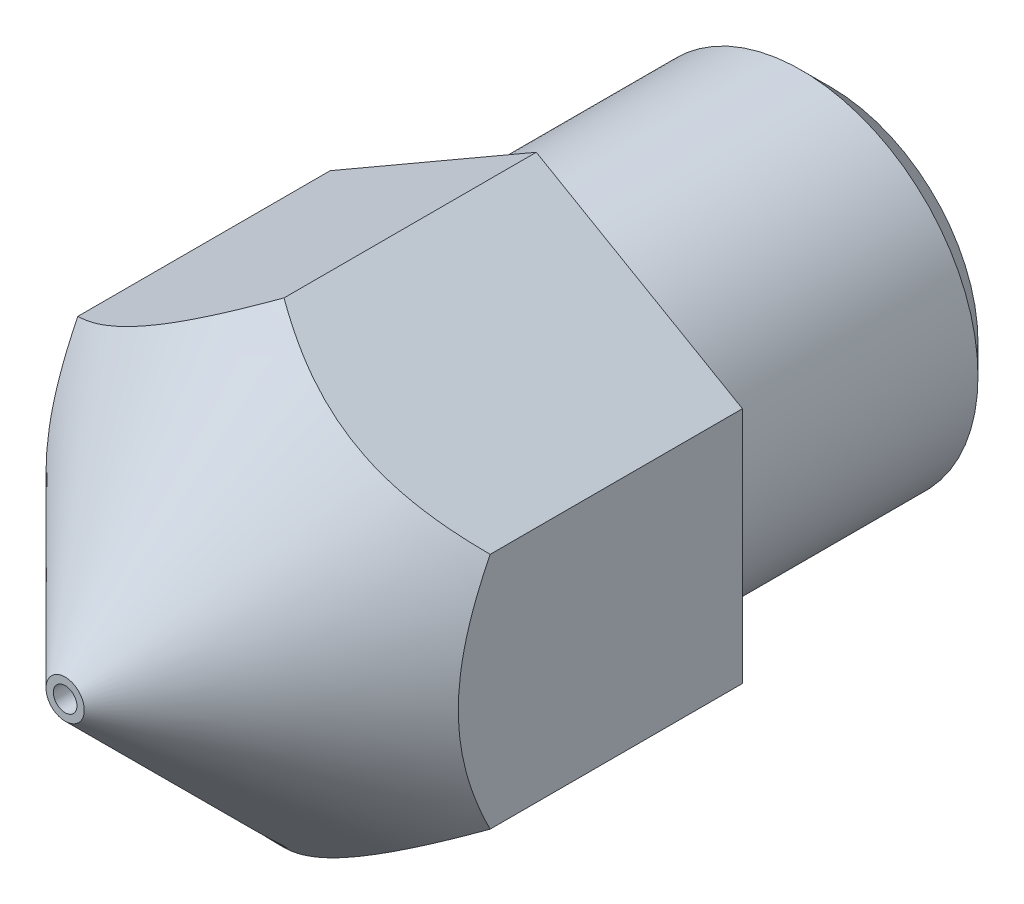
ISO-10303-21;
HEADER;
FILE_DESCRIPTION(('STEP AP214'),'2;1');
FILE_NAME('part.step','',(''),(''),'','','');
FILE_SCHEMA(('AUTOMOTIVE_DESIGN { 1 0 10303 214 1 1 1 1 }'));
ENDSEC;
DATA;
#1=APPLICATION_CONTEXT('core data for automotive mechanical design processes');
#2=APPLICATION_PROTOCOL_DEFINITION('international standard','automotive_design',2000,#1);
#3=PRODUCT_CONTEXT('',#1,'mechanical');
#4=PRODUCT('Part','Part','',(#3));
#5=PRODUCT_RELATED_PRODUCT_CATEGORY('part','',(#4));
#6=PRODUCT_DEFINITION_FORMATION('','',#4);
#7=PRODUCT_DEFINITION_CONTEXT('part definition',#1,'design');
#8=PRODUCT_DEFINITION('design','',#6,#7);
#9=PRODUCT_DEFINITION_SHAPE('','',#8);
#10=(LENGTH_UNIT() NAMED_UNIT(*) SI_UNIT(.MILLI.,.METRE.));
#11=(NAMED_UNIT(*) PLANE_ANGLE_UNIT() SI_UNIT($,.RADIAN.));
#12=(NAMED_UNIT(*) SI_UNIT($,.STERADIAN.) SOLID_ANGLE_UNIT());
#13=UNCERTAINTY_MEASURE_WITH_UNIT(LENGTH_MEASURE(1.E-05),#10,'distance_accuracy_value','');
#14=(GEOMETRIC_REPRESENTATION_CONTEXT(3) GLOBAL_UNCERTAINTY_ASSIGNED_CONTEXT((#13)) GLOBAL_UNIT_ASSIGNED_CONTEXT((#10,
#11,#12)) REPRESENTATION_CONTEXT('',''));
#15=CARTESIAN_POINT('',(0.,0.,0.));
#16=DIRECTION('',(0.,0.,1.));
#17=DIRECTION('',(1.,0.,0.));
#18=AXIS2_PLACEMENT_3D('',#15,#16,#17);
#19=CARTESIAN_POINT('',(0.,0.,13.));
#20=DIRECTION('',(0.,0.,-1.));
#21=DIRECTION('',(-1.,0.,0.));
#22=AXIS2_PLACEMENT_3D('',#19,#20,#21);
#23=CONICAL_SURFACE('',#22,0.325000000000002,0.785398163397447);
#24=CARTESIAN_POINT('',(0.,0.,13.));
#25=DIRECTION('',(0.,0.,-1.));
#26=DIRECTION('',(-1.,0.,0.));
#27=AXIS2_PLACEMENT_3D('',#24,#25,#26);
#28=CIRCLE('',#27,0.325000000000002);
#29=CARTESIAN_POINT('',(-0.325000000000002,0.,13.));
#30=VERTEX_POINT('',#29);
#31=EDGE_CURVE('E182',#30,#30,#28,.T.);
#32=ORIENTED_EDGE('',*,*,#31,.T.);
#33=EDGE_LOOP('',(#32));
#34=FACE_BOUND('',#33,.T.);
#35=CARTESIAN_POINT('',(3.5,-15.5234481897634,-2.58812174591366));
#36=CARTESIAN_POINT('',(3.5,-15.1636242601623,-2.23712539732561));
#37=CARTESIAN_POINT('',(3.5,-14.8035205175906,-1.88641516489563));
#38=CARTESIAN_POINT('',(3.5,-14.0819201954618,-1.18510371729995));
#39=CARTESIAN_POINT('',(3.5,-13.7204222725227,-0.834503884606979));
#40=CARTESIAN_POINT('',(3.5,-12.9851632461589,-0.123253918607061));
#41=CARTESIAN_POINT('',(3.5,-12.6113732691067,0.237366383018881));
#42=CARTESIAN_POINT('',(3.5,-11.8632476898643,0.956650604807089));
#43=CARTESIAN_POINT('',(3.5,-11.4889143844432,1.3153169126455));
#44=CARTESIAN_POINT('',(3.5,-10.7337152504074,2.03564308802298));
#45=CARTESIAN_POINT('',(3.5,-10.3528280885022,2.39728061377324));
#46=CARTESIAN_POINT('',(3.5,-9.58872388033201,3.11825712856995));
#47=CARTESIAN_POINT('',(3.5,-9.20550633866682,3.47759559300201));
#48=CARTESIAN_POINT('',(3.5,-8.43292594909807,4.19572688391259));
#49=CARTESIAN_POINT('',(3.5,-8.04353847587837,4.55449330824109));
#50=CARTESIAN_POINT('',(3.5,-7.45613433125934,5.08865399411039));
#51=CARTESIAN_POINT('',(3.5,-7.25986380764518,5.2659677223504));
#52=CARTESIAN_POINT('',(3.5,-6.86588186461854,5.61898578873293));
#53=CARTESIAN_POINT('',(3.5,-6.66817045798153,5.79469014111373));
#54=CARTESIAN_POINT('',(3.5,-6.27710677250364,6.13864603820222));
#55=CARTESIAN_POINT('',(3.5,-6.08380929608817,6.30695979649324));
#56=CARTESIAN_POINT('',(3.5,-5.69508116254242,6.64113302112362));
#57=CARTESIAN_POINT('',(3.5,-5.49965038532669,6.80699234804992));
#58=CARTESIAN_POINT('',(3.5,-5.10539453520259,7.13604194454556));
#59=CARTESIAN_POINT('',(3.5,-4.90656004527705,7.29922097042713));
#60=CARTESIAN_POINT('',(3.5,-4.50537353784658,7.62113735661519));
#61=CARTESIAN_POINT('',(3.5,-4.30302214236045,7.77987548965845));
#62=CARTESIAN_POINT('',(3.5,-3.89676183067198,8.08882331868253));
#63=CARTESIAN_POINT('',(3.5,-3.69292489418594,8.23912670823939));
#64=CARTESIAN_POINT('',(3.5,-3.38250138019312,8.45817533010815));
#65=CARTESIAN_POINT('',(3.5,-3.27819886554989,8.53015603273438));
#66=CARTESIAN_POINT('',(3.5,-3.06781525297658,8.67146340791987));
#67=CARTESIAN_POINT('',(3.5,-2.96173428541553,8.74079027380531));
#68=CARTESIAN_POINT('',(3.5,-2.74814793574133,8.87578541870253));
#69=CARTESIAN_POINT('',(3.5,-2.64065485663612,8.94147308798704));
#70=CARTESIAN_POINT('',(3.5,-2.42330140274558,9.06887107421913));
#71=CARTESIAN_POINT('',(3.5,-2.31344068232646,9.13058080513782));
#72=CARTESIAN_POINT('',(3.5,-2.09124355588498,9.24891478346324));
#73=CARTESIAN_POINT('',(3.5,-1.97891174750918,9.30554762001907));
#74=CARTESIAN_POINT('',(3.5,-1.75133226285868,9.41257237776955));
#75=CARTESIAN_POINT('',(3.5,-1.63608601506468,9.46296728765808));
#76=CARTESIAN_POINT('',(3.5,-1.49025089005427,9.52103644619228));
#77=CARTESIAN_POINT('',(3.5,-1.46110056481546,9.53236470492607));
#78=CARTESIAN_POINT('',(3.5,-1.402601107607,9.55451508791755));
#79=CARTESIAN_POINT('',(3.5,-1.37325193594393,9.56533710749575));
#80=CARTESIAN_POINT('',(3.5,-1.28488951412708,9.59700909912121));
#81=CARTESIAN_POINT('',(3.5,-1.22558525994879,9.61705544160064));
#82=CARTESIAN_POINT('',(3.5,-1.10624184328518,9.65477285811323));
#83=CARTESIAN_POINT('',(3.5,-1.04620287938741,9.67244455917323));
#84=CARTESIAN_POINT('',(3.5,-0.92542254777725,9.70518946936908));
#85=CARTESIAN_POINT('',(3.5,-0.864681236092734,9.72026288427077));
#86=CARTESIAN_POINT('',(3.5,-0.744176235583252,9.74722921369906));
#87=CARTESIAN_POINT('',(3.5,-0.684429101789748,9.75919561995199));
#88=CARTESIAN_POINT('',(3.5,-0.564438250966739,9.78027207473867));
#89=CARTESIAN_POINT('',(3.5,-0.504194540567017,9.7893821613439));
#90=CARTESIAN_POINT('',(3.5,-0.322837843942376,9.81218328184672));
#91=CARTESIAN_POINT('',(3.5,-0.201113027289824,9.82134203443566));
#92=CARTESIAN_POINT('',(3.5,0.0380130971471712,9.82675953589181));
#93=CARTESIAN_POINT('',(3.5,0.155404466788706,9.82349141691179));
#94=CARTESIAN_POINT('',(3.5,0.389244043366204,9.80535184085907));
#95=CARTESIAN_POINT('',(3.5,0.505692490432156,9.79048343829789));
#96=CARTESIAN_POINT('',(3.5,0.737684831131093,9.74994653628783));
#97=CARTESIAN_POINT('',(3.5,0.853212486127755,9.72418681194919));
#98=CARTESIAN_POINT('',(3.5,1.08176746257524,9.66329658620028));
#99=CARTESIAN_POINT('',(3.5,1.19479404392223,9.62816335015079));
#100=CARTESIAN_POINT('',(3.5,1.42047293020801,9.54924566948267));
#101=CARTESIAN_POINT('',(3.5,1.53306533107008,9.50529199646975));
#102=CARTESIAN_POINT('',(3.5,1.75543329006004,9.41074245035333));
#103=CARTESIAN_POINT('',(3.5,1.8652080370074,9.36014468954995));
#104=CARTESIAN_POINT('',(3.5,2.08227629391203,9.25352327896908));
#105=CARTESIAN_POINT('',(3.5,2.18956577780165,9.19749149693629));
#106=CARTESIAN_POINT('',(3.5,2.40174552846124,9.08112035594987));
#107=CARTESIAN_POINT('',(3.5,2.5066361730213,9.02078168153802));
#108=CARTESIAN_POINT('',(3.5,2.71579156320912,8.8957338997214));
#109=CARTESIAN_POINT('',(3.5,2.82002639429815,8.83097498995069));
#110=CARTESIAN_POINT('',(3.5,3.02662080629836,8.6985379897759));
#111=CARTESIAN_POINT('',(3.5,3.12898034259079,8.63085983004252));
#112=CARTESIAN_POINT('',(3.5,3.33197761839238,8.49317681854608));
#113=CARTESIAN_POINT('',(3.5,3.4326168831748,8.42317420922879));
#114=CARTESIAN_POINT('',(3.5,3.63248156564202,8.28119277503341));
#115=CARTESIAN_POINT('',(3.5,3.73170703846633,8.20921402754922));
#116=CARTESIAN_POINT('',(3.5,4.06086329165638,7.96624133315297));
#117=CARTESIAN_POINT('',(3.5,4.28809301128115,7.79158774422029));
#118=CARTESIAN_POINT('',(3.5,4.73778042292989,7.43622370645637));
#119=CARTESIAN_POINT('',(3.5,4.96023728057273,7.25551221251901));
#120=CARTESIAN_POINT('',(3.5,5.40169374802767,6.88970411681872));
#121=CARTESIAN_POINT('',(3.5,5.6206915797464,6.7046053747019));
#122=CARTESIAN_POINT('',(3.5,6.05598531098002,6.33125553360428));
#123=CARTESIAN_POINT('',(3.5,6.27228113350623,6.14300434515649));
#124=CARTESIAN_POINT('',(3.5,6.70327139644728,5.76369333069582));
#125=CARTESIAN_POINT('',(3.5,6.91796104039656,5.57262806384923));
#126=CARTESIAN_POINT('',(3.5,7.34568317702818,5.18864806158685));
#127=CARTESIAN_POINT('',(3.5,7.55871564473748,4.99573329839726));
#128=CARTESIAN_POINT('',(3.5,8.19570678017715,4.41495098768638));
#129=CARTESIAN_POINT('',(3.5,8.61769582122788,4.02492418910578));
#130=CARTESIAN_POINT('',(3.5,9.4059343366299,3.28985339178753));
#131=CARTESIAN_POINT('',(3.5,9.77259156299894,2.94524491706271));
#132=CARTESIAN_POINT('',(3.5,10.5039660521083,2.25390920904621));
#133=CARTESIAN_POINT('',(3.5,10.868683134223,1.90718178472289));
#134=CARTESIAN_POINT('',(3.5,11.5951246442549,1.21363081090819));
#135=CARTESIAN_POINT('',(3.5,11.9568552096618,0.866813682093247));
#136=CARTESIAN_POINT('',(3.5,12.6791294576359,0.17202194664951));
#137=CARTESIAN_POINT('',(3.5,13.0396732620959,-0.175952533226272));
#138=CARTESIAN_POINT('',(3.5,13.3998004503878,-0.524355656860472));
#139=B_SPLINE_CURVE_WITH_KNOTS('',3,(#35,#36,#37,#38,#39,#40,#41,#42,#43,#44,#45,#46,#47,#48,
#49,#50,#51,#52,#53,#54,#55,#56,#57,#58,#59,#60,#61,#62,#63,#64,#65,#66,#67,#68,#69,#70,#71,#72,
#73,#74,#75,#76,#77,#78,#79,#80,#81,#82,#83,#84,#85,#86,#87,#88,#89,#90,#91,#92,#93,#94,#95,#96,
#97,#98,#99,#100,#101,#102,#103,#104,#105,#106,#107,#108,#109,#110,#111,#112,#113,#114,#115,
#116,#117,#118,#119,#120,#121,#122,#123,#124,#125,#126,#127,#128,#129,#130,#131,#132,#133,#134,
#135,#136,#137,#138),.UNSPECIFIED.,.F.,.F.,(4,2,2,2,2,2,2,2,2,2,2,2,2,2,2,2,2,2,2,2,2,2,2,2,2,2,
2,2,2,2,2,2,2,2,2,2,2,2,2,2,2,2,2,2,2,2,2,2,2,2,2,4),(0.,1.5079943903288,3.01875757635978,
4.5769250878872,6.13220347788174,7.7078576409595,9.28385936663637,10.8722264785119,
11.6657313510458,12.4592291965835,13.2281351674854,13.9970846463216,14.7686993525777,
15.5401789483606,16.2997773384333,16.6799331242335,17.0600611636139,17.4379172356492,
17.8158288467267,18.1930885358389,18.5701667681494,18.6639857705343,18.7578240877067,
18.9455779113769,19.1332820605991,19.3209713381475,19.5037030933086,19.6864324127608,
20.0519331395699,20.4036598996594,20.7552940765806,21.1099337580521,21.4646770158676,
21.8270208208417,22.1894677975897,22.5524658178429,22.9154062707506,23.2834880438917,
23.6515785634306,24.0193237446915,24.3870545439897,25.246664428781,26.1064233839793,
26.9666107827922,27.826822635382,28.6890027213321,29.5511957749455,31.2750339328956,
32.7845731128908,34.2942504527183,35.7976371762235,37.3008643410337),.UNSPECIFIED.);
#140=CARTESIAN_POINT('',(3.5,2.02072594216368,9.28354811567261));
#141=VERTEX_POINT('',#140);
#142=CARTESIAN_POINT('',(3.5,-2.0207259421637,9.2835481156726));
#143=VERTEX_POINT('',#142);
#144=EDGE_CURVE('E158',#141,#143,#139,.F.);
#145=ORIENTED_EDGE('',*,*,#144,.F.);
#146=CARTESIAN_POINT('',(-0.000199999999999833,4.04156735438121,9.2834326406702));
#147=CARTESIAN_POINT('',(0.120108757817009,3.97210706066969,9.35283218194129));
#148=CARTESIAN_POINT('',(0.242429214365458,3.90148531215405,9.41815563681709));
#149=CARTESIAN_POINT('',(0.491853884911904,3.75747991147152,9.53776106398608));
#150=CARTESIAN_POINT('',(0.61898181684255,3.68408256574984,9.59197649279322));
#151=CARTESIAN_POINT('',(0.875329162282521,3.53608035685403,9.68484844043878));
#152=CARTESIAN_POINT('',(1.00448329914368,3.46151318117029,9.72373837546509));
#153=CARTESIAN_POINT('',(1.26563479388694,3.31073729538099,9.78365621127953));
#154=CARTESIAN_POINT('',(1.39762417499827,3.23453319066619,9.80472883532499));
#155=CARTESIAN_POINT('',(1.62510370665134,3.10319782183117,9.82374200102426));
#156=CARTESIAN_POINT('',(1.72030010780514,3.04823615399913,9.82655641581267));
#157=CARTESIAN_POINT('',(1.91053805112477,2.93840222621346,9.82181342823267));
#158=CARTESIAN_POINT('',(2.00557952731161,2.88353000435281,9.8142523899156));
#159=CARTESIAN_POINT('',(2.19476205337608,2.77430542200351,9.78919021941821));
#160=CARTESIAN_POINT('',(2.28890197617048,2.71995371223668,9.77167796929251));
#161=CARTESIAN_POINT('',(2.47556499941575,2.61218376551827,9.7276692182783));
#162=CARTESIAN_POINT('',(2.56808822325594,2.55876545732784,9.70117340620827));
#163=CARTESIAN_POINT('',(2.73234167964214,2.46393368006795,9.64666014623829));
#164=CARTESIAN_POINT('',(2.80443551971226,2.42231028209655,9.62007581182285));
#165=CARTESIAN_POINT('',(2.94732893971228,2.33981072759411,9.56262274070929));
#166=CARTESIAN_POINT('',(3.01812848014491,2.29893459386683,9.53175387350915));
#167=CARTESIAN_POINT('',(3.15821024645784,2.2180583483775,9.46642377502848));
#168=CARTESIAN_POINT('',(3.22749645656527,2.17805593632085,9.43197384002165));
#169=CARTESIAN_POINT('',(3.36478573118621,2.0987919366616,9.35993401595728));
#170=CARTESIAN_POINT('',(3.43278955208019,2.05952991236254,9.32234605361207));
#171=CARTESIAN_POINT('',(3.5002,2.02061047210984,9.2834326406702));
#172=B_SPLINE_CURVE_WITH_KNOTS('',3,(#146,#147,#148,#149,#150,#151,#152,#153,#154,#155,#156,
#157,#158,#159,#160,#161,#162,#163,#164,#165,#166,#167,#168,#169,#170,#171),.UNSPECIFIED.,.F.,
.F.,(4,2,2,2,2,2,2,2,2,2,2,2,4),(0.,0.466195029511833,0.935106055247662,1.39657035229709,
1.85687285909024,2.18628459516075,2.5158117989677,2.84570789142398,3.17557869467335,
3.43762138891187,3.6996720664268,3.96091985737576,4.22200840855896),.UNSPECIFIED.);
#173=CARTESIAN_POINT('',(0.,4.04145188432738,9.28354811567261));
#174=VERTEX_POINT('',#173);
#175=EDGE_CURVE('E165',#174,#141,#172,.T.);
#176=ORIENTED_EDGE('',*,*,#175,.F.);
#177=CARTESIAN_POINT('',(-3.5002,2.02061047210984,9.2834326406702));
#178=CARTESIAN_POINT('',(-3.37989124218299,2.09007076582136,9.35283218194128));
#179=CARTESIAN_POINT('',(-3.25757078563454,2.16069251433701,9.41815563681708));
#180=CARTESIAN_POINT('',(-3.0081461150881,2.30469791501953,9.53776106398608));
#181=CARTESIAN_POINT('',(-2.88101818315745,2.37809526074121,9.59197649279322));
#182=CARTESIAN_POINT('',(-2.62467083771748,2.52609746963702,9.68484844043878));
#183=CARTESIAN_POINT('',(-2.49551670085632,2.60066464532077,9.72373837546509));
#184=CARTESIAN_POINT('',(-2.23436520611306,2.75144053111006,9.78365621127953));
#185=CARTESIAN_POINT('',(-2.10237582500173,2.82764463582486,9.80472883532499));
#186=CARTESIAN_POINT('',(-1.87489629334866,2.95898000465989,9.82374200102426));
#187=CARTESIAN_POINT('',(-1.77969989219486,3.01394167249192,9.82655641581267));
#188=CARTESIAN_POINT('',(-1.58946194887523,3.12377560027759,9.82181342823267));
#189=CARTESIAN_POINT('',(-1.49442047268839,3.17864782213824,9.8142523899156));
#190=CARTESIAN_POINT('',(-1.30523794662392,3.28787240448754,9.78919021941821));
#191=CARTESIAN_POINT('',(-1.21109802382952,3.34222411425438,9.77167796929251));
#192=CARTESIAN_POINT('',(-1.02443500058425,3.44999406097278,9.7276692182783));
#193=CARTESIAN_POINT('',(-0.931911776744056,3.50341236916321,9.70117340620827));
#194=CARTESIAN_POINT('',(-0.767658320357864,3.59824414642311,9.64666014623829));
#195=CARTESIAN_POINT('',(-0.695564480287738,3.63986754439451,9.62007581182285));
#196=CARTESIAN_POINT('',(-0.552671060287718,3.72236709889694,9.56262274070929));
#197=CARTESIAN_POINT('',(-0.481871519855094,3.76324323262422,9.53175387350915));
#198=CARTESIAN_POINT('',(-0.341789753542163,3.84411947811355,9.46642377502848));
#199=CARTESIAN_POINT('',(-0.27250354343473,3.88412189017021,9.43197384002165));
#200=CARTESIAN_POINT('',(-0.135214268813791,3.96338588982945,9.35993401595728));
#201=CARTESIAN_POINT('',(-0.0672104479198125,4.00264791412852,9.32234605361207));
#202=CARTESIAN_POINT('',(0.000199999999999993,4.04156735438121,9.2834326406702));
#203=B_SPLINE_CURVE_WITH_KNOTS('',3,(#177,#178,#179,#180,#181,#182,#183,#184,#185,#186,#187,
#188,#189,#190,#191,#192,#193,#194,#195,#196,#197,#198,#199,#200,#201,#202),.UNSPECIFIED.,.F.,
.F.,(4,2,2,2,2,2,2,2,2,2,2,2,4),(0.,0.466195029511832,0.935106055247662,1.39657035229709,
1.85687285909024,2.18628459516075,2.5158117989677,2.84570789142398,3.17557869467335,
3.43762138891187,3.6996720664268,3.96091985737577,4.22200840855896),.UNSPECIFIED.);
#204=CARTESIAN_POINT('',(-3.5,2.02072594216368,9.28354811567261));
#205=VERTEX_POINT('',#204);
#206=EDGE_CURVE('E216',#205,#174,#203,.T.);
#207=ORIENTED_EDGE('',*,*,#206,.F.);
#208=CARTESIAN_POINT('',(-3.5,-15.5234481897634,-2.58812174591365));
#209=CARTESIAN_POINT('',(-3.5,-15.1636242601623,-2.23712539732559));
#210=CARTESIAN_POINT('',(-3.5,-14.8035205175906,-1.88641516489561));
#211=CARTESIAN_POINT('',(-3.5,-14.0819201954618,-1.18510371729994));
#212=CARTESIAN_POINT('',(-3.5,-13.7204222725226,-0.834503884606961));
#213=CARTESIAN_POINT('',(-3.5,-12.9851632461589,-0.12325391860704));
#214=CARTESIAN_POINT('',(-3.5,-12.6113732691067,0.237366383018904));
#215=CARTESIAN_POINT('',(-3.5,-11.8632476898643,0.956650604807113));
#216=CARTESIAN_POINT('',(-3.5,-11.4889143844432,1.31531691264553));
#217=CARTESIAN_POINT('',(-3.5,-10.7337152504074,2.035643088023));
#218=CARTESIAN_POINT('',(-3.5,-10.3528280885022,2.39728061377326));
#219=CARTESIAN_POINT('',(-3.5,-9.58872388033199,3.11825712856997));
#220=CARTESIAN_POINT('',(-3.5,-9.2055063386668,3.47759559300203));
#221=CARTESIAN_POINT('',(-3.5,-8.43292594909805,4.19572688391261));
#222=CARTESIAN_POINT('',(-3.5,-8.04353847587835,4.5544933082411));
#223=CARTESIAN_POINT('',(-3.5,-7.45613433125932,5.08865399411041));
#224=CARTESIAN_POINT('',(-3.5,-7.25986380764516,5.26596772235041));
#225=CARTESIAN_POINT('',(-3.5,-6.86588186461853,5.61898578873294));
#226=CARTESIAN_POINT('',(-3.5,-6.66817045798152,5.79469014111374));
#227=CARTESIAN_POINT('',(-3.5,-6.27710677250363,6.13864603820223));
#228=CARTESIAN_POINT('',(-3.5,-6.08380929608816,6.30695979649325));
#229=CARTESIAN_POINT('',(-3.5,-5.6950811625424,6.64113302112363));
#230=CARTESIAN_POINT('',(-3.5,-5.49965038532668,6.80699234804993));
#231=CARTESIAN_POINT('',(-3.5,-5.10539453520258,7.13604194454557));
#232=CARTESIAN_POINT('',(-3.5,-4.90656004527704,7.29922097042714));
#233=CARTESIAN_POINT('',(-3.5,-4.50537353784658,7.6211373566152));
#234=CARTESIAN_POINT('',(-3.5,-4.30302214236044,7.77987548965846));
#235=CARTESIAN_POINT('',(-3.5,-3.89676183067197,8.08882331868254));
#236=CARTESIAN_POINT('',(-3.5,-3.69292489418593,8.2391267082394));
#237=CARTESIAN_POINT('',(-3.5,-3.38250138019311,8.45817533010816));
#238=CARTESIAN_POINT('',(-3.5,-3.27819886554989,8.53015603273439));
#239=CARTESIAN_POINT('',(-3.5,-3.06781525297657,8.67146340791988));
#240=CARTESIAN_POINT('',(-3.5,-2.96173428541553,8.74079027380532));
#241=CARTESIAN_POINT('',(-3.5,-2.74814793574133,8.87578541870253));
#242=CARTESIAN_POINT('',(-3.5,-2.64065485663612,8.94147308798704));
#243=CARTESIAN_POINT('',(-3.5,-2.42330140274558,9.06887107421913));
#244=CARTESIAN_POINT('',(-3.5,-2.31344068232646,9.13058080513782));
#245=CARTESIAN_POINT('',(-3.5,-2.09124355588497,9.24891478346324));
#246=CARTESIAN_POINT('',(-3.5,-1.97891174750918,9.30554762001907));
#247=CARTESIAN_POINT('',(-3.5,-1.75133226285868,9.41257237776955));
#248=CARTESIAN_POINT('',(-3.5,-1.63608601506468,9.46296728765808));
#249=CARTESIAN_POINT('',(-3.5,-1.49025089005427,9.52103644619228));
#250=CARTESIAN_POINT('',(-3.5,-1.46110056481546,9.53236470492607));
#251=CARTESIAN_POINT('',(-3.5,-1.402601107607,9.55451508791755));
#252=CARTESIAN_POINT('',(-3.5,-1.37325193594393,9.56533710749575));
#253=CARTESIAN_POINT('',(-3.5,-1.28488951412708,9.59700909912121));
#254=CARTESIAN_POINT('',(-3.5,-1.22558525994879,9.61705544160064));
#255=CARTESIAN_POINT('',(-3.5,-1.10624184328518,9.65477285811323));
#256=CARTESIAN_POINT('',(-3.5,-1.04620287938741,9.67244455917323));
#257=CARTESIAN_POINT('',(-3.5,-0.925422547777247,9.70518946936908));
#258=CARTESIAN_POINT('',(-3.5,-0.864681236092731,9.72026288427077));
#259=CARTESIAN_POINT('',(-3.5,-0.744176235583247,9.74722921369906));
#260=CARTESIAN_POINT('',(-3.5,-0.684429101789744,9.75919561995199));
#261=CARTESIAN_POINT('',(-3.5,-0.564438250966734,9.78027207473867));
#262=CARTESIAN_POINT('',(-3.5,-0.504194540567012,9.7893821613439));
#263=CARTESIAN_POINT('',(-3.5,-0.322837843942373,9.81218328184672));
#264=CARTESIAN_POINT('',(-3.5,-0.201113027289823,9.82134203443566));
#265=CARTESIAN_POINT('',(-3.5,0.0380130971471705,9.82675953589181));
#266=CARTESIAN_POINT('',(-3.5,0.155404466788705,9.82349141691179));
#267=CARTESIAN_POINT('',(-3.5,0.389244043366203,9.80535184085907));
#268=CARTESIAN_POINT('',(-3.5,0.505692490432156,9.79048343829789));
#269=CARTESIAN_POINT('',(-3.5,0.737684831131092,9.74994653628783));
#270=CARTESIAN_POINT('',(-3.5,0.853212486127755,9.72418681194919));
#271=CARTESIAN_POINT('',(-3.5,1.08176746257524,9.66329658620028));
#272=CARTESIAN_POINT('',(-3.5,1.19479404392223,9.62816335015079));
#273=CARTESIAN_POINT('',(-3.5,1.42047293020801,9.54924566948267));
#274=CARTESIAN_POINT('',(-3.5,1.53306533107008,9.50529199646975));
#275=CARTESIAN_POINT('',(-3.5,1.75543329006004,9.41074245035333));
#276=CARTESIAN_POINT('',(-3.5,1.8652080370074,9.36014468954995));
#277=CARTESIAN_POINT('',(-3.5,2.08227629391203,9.25352327896908));
#278=CARTESIAN_POINT('',(-3.5,2.18956577780165,9.19749149693629));
#279=CARTESIAN_POINT('',(-3.5,2.40174552846124,9.08112035594987));
#280=CARTESIAN_POINT('',(-3.5,2.5066361730213,9.02078168153802));
#281=CARTESIAN_POINT('',(-3.5,2.71579156320912,8.8957338997214));
#282=CARTESIAN_POINT('',(-3.5,2.82002639429816,8.83097498995069));
#283=CARTESIAN_POINT('',(-3.5,3.02662080629836,8.6985379897759));
#284=CARTESIAN_POINT('',(-3.5,3.12898034259079,8.63085983004252));
#285=CARTESIAN_POINT('',(-3.5,3.33197761839238,8.49317681854608));
#286=CARTESIAN_POINT('',(-3.5,3.4326168831748,8.42317420922879));
#287=CARTESIAN_POINT('',(-3.5,3.63248156564202,8.28119277503341));
#288=CARTESIAN_POINT('',(-3.5,3.73170703846634,8.20921402754922));
#289=CARTESIAN_POINT('',(-3.5,4.06086329165638,7.96624133315297));
#290=CARTESIAN_POINT('',(-3.5,4.28809301128114,7.79158774422029));
#291=CARTESIAN_POINT('',(-3.5,4.73778042292989,7.43622370645637));
#292=CARTESIAN_POINT('',(-3.5,4.96023728057273,7.25551221251901));
#293=CARTESIAN_POINT('',(-3.5,5.40169374802767,6.88970411681871));
#294=CARTESIAN_POINT('',(-3.5,5.6206915797464,6.7046053747019));
#295=CARTESIAN_POINT('',(-3.5,6.05598531098002,6.33125553360427));
#296=CARTESIAN_POINT('',(-3.5,6.27228113350623,6.14300434515649));
#297=CARTESIAN_POINT('',(-3.5,6.70327139644728,5.76369333069582));
#298=CARTESIAN_POINT('',(-3.5,6.91796104039656,5.57262806384922));
#299=CARTESIAN_POINT('',(-3.5,7.34568317702818,5.18864806158684));
#300=CARTESIAN_POINT('',(-3.5,7.55871564473748,4.99573329839725));
#301=CARTESIAN_POINT('',(-3.5,8.19570678017715,4.41495098768638));
#302=CARTESIAN_POINT('',(-3.5,8.61769582122788,4.02492418910577));
#303=CARTESIAN_POINT('',(-3.5,9.4059343366299,3.28985339178752));
#304=CARTESIAN_POINT('',(-3.5,9.77259156299894,2.94524491706271));
#305=CARTESIAN_POINT('',(-3.5,10.5039660521083,2.25390920904621));
#306=CARTESIAN_POINT('',(-3.5,10.868683134223,1.90718178472289));
#307=CARTESIAN_POINT('',(-3.5,11.5951246442549,1.21363081090819));
#308=CARTESIAN_POINT('',(-3.5,11.9568552096618,0.866813682093245));
#309=CARTESIAN_POINT('',(-3.5,12.6791294576359,0.172021946649511));
#310=CARTESIAN_POINT('',(-3.5,13.0396732620959,-0.175952533226269));
#311=CARTESIAN_POINT('',(-3.5,13.3998004503877,-0.524355656860467));
#312=B_SPLINE_CURVE_WITH_KNOTS('',3,(#208,#209,#210,#211,#212,#213,#214,#215,#216,#217,#218,
#219,#220,#221,#222,#223,#224,#225,#226,#227,#228,#229,#230,#231,#232,#233,#234,#235,#236,#237,
#238,#239,#240,#241,#242,#243,#244,#245,#246,#247,#248,#249,#250,#251,#252,#253,#254,#255,#256,
#257,#258,#259,#260,#261,#262,#263,#264,#265,#266,#267,#268,#269,#270,#271,#272,#273,#274,#275,
#276,#277,#278,#279,#280,#281,#282,#283,#284,#285,#286,#287,#288,#289,#290,#291,#292,#293,#294,
#295,#296,#297,#298,#299,#300,#301,#302,#303,#304,#305,#306,#307,#308,#309,#310,#311),
.UNSPECIFIED.,.F.,.F.,(4,2,2,2,2,2,2,2,2,2,2,2,2,2,2,2,2,2,2,2,2,2,2,2,2,2,2,2,2,2,2,2,2,2,2,2,
2,2,2,2,2,2,2,2,2,2,2,2,2,2,2,4),(0.,1.5079943903288,3.01875757635979,4.57692508788722,
6.13220347788176,7.70785764095951,9.28385936663638,10.8722264785119,11.6657313510458,
12.4592291965835,13.2281351674854,13.9970846463215,14.7686993525777,15.5401789483606,
16.2997773384333,16.6799331242335,17.0600611636139,17.4379172356491,17.8158288467267,
18.1930885358389,18.5701667681493,18.6639857705343,18.7578240877067,18.9455779113769,
19.1332820605991,19.3209713381474,19.5037030933085,19.6864324127608,20.0519331395699,
20.4036598996594,20.7552940765806,21.1099337580521,21.4646770158675,21.8270208208417,
22.1894677975896,22.5524658178428,22.9154062707506,23.2834880438917,23.6515785634306,
24.0193237446914,24.3870545439897,25.246664428781,26.1064233839793,26.9666107827922,
27.826822635382,28.689002721332,29.5511957749455,31.2750339328955,32.7845731128908,
34.2942504527183,35.7976371762235,37.3008643410336),.UNSPECIFIED.);
#313=CARTESIAN_POINT('',(-3.5,-2.0207259421637,9.2835481156726));
#314=VERTEX_POINT('',#313);
#315=EDGE_CURVE('E217',#314,#205,#312,.T.);
#316=ORIENTED_EDGE('',*,*,#315,.F.);
#317=CARTESIAN_POINT('',(0.000199999999999614,-4.04156735438121,9.2834326406702));
#318=CARTESIAN_POINT('',(-0.120108757817009,-3.9721070606697,9.35283218194128));
#319=CARTESIAN_POINT('',(-0.242429214365457,-3.90148531215405,9.41815563681708));
#320=CARTESIAN_POINT('',(-0.491853884911902,-3.75747991147153,9.53776106398608));
#321=CARTESIAN_POINT('',(-0.618981816842547,-3.68408256574985,9.59197649279321));
#322=CARTESIAN_POINT('',(-0.875329162282517,-3.53608035685404,9.68484844043877));
#323=CARTESIAN_POINT('',(-1.00448329914367,-3.4615131811703,9.72373837546509));
#324=CARTESIAN_POINT('',(-1.26563479388694,-3.310737295381,9.78365621127953));
#325=CARTESIAN_POINT('',(-1.39762417499827,-3.2345331906662,9.80472883532498));
#326=CARTESIAN_POINT('',(-1.62510370665133,-3.10319782183118,9.82374200102426));
#327=CARTESIAN_POINT('',(-1.72030010780514,-3.04823615399914,9.82655641581266));
#328=CARTESIAN_POINT('',(-1.91053805112477,-2.93840222621348,9.82181342823266));
#329=CARTESIAN_POINT('',(-2.00557952731161,-2.88353000435283,9.81425238991559));
#330=CARTESIAN_POINT('',(-2.19476205337608,-2.77430542200353,9.78919021941821));
#331=CARTESIAN_POINT('',(-2.28890197617048,-2.71995371223669,9.7716779692925));
#332=CARTESIAN_POINT('',(-2.47556499941575,-2.61218376551829,9.72766921827829));
#333=CARTESIAN_POINT('',(-2.56808822325594,-2.55876545732786,9.70117340620827));
#334=CARTESIAN_POINT('',(-2.73234167964214,-2.46393368006796,9.64666014623828));
#335=CARTESIAN_POINT('',(-2.80443551971226,-2.42231028209656,9.62007581182284));
#336=CARTESIAN_POINT('',(-2.94732893971228,-2.33981072759413,9.56262274070928));
#337=CARTESIAN_POINT('',(-3.01812848014491,-2.29893459386685,9.53175387350914));
#338=CARTESIAN_POINT('',(-3.15821024645784,-2.21805834837752,9.46642377502848));
#339=CARTESIAN_POINT('',(-3.22749645656527,-2.17805593632087,9.43197384002164));
#340=CARTESIAN_POINT('',(-3.36478573118621,-2.09879193666162,9.35993401595727));
#341=CARTESIAN_POINT('',(-3.43278955208019,-2.05952991236256,9.32234605361205));
#342=CARTESIAN_POINT('',(-3.5002,-2.02061047210986,9.28343264067019));
#343=B_SPLINE_CURVE_WITH_KNOTS('',3,(#317,#318,#319,#320,#321,#322,#323,#324,#325,#326,#327,
#328,#329,#330,#331,#332,#333,#334,#335,#336,#337,#338,#339,#340,#341,#342),.UNSPECIFIED.,.F.,
.F.,(4,2,2,2,2,2,2,2,2,2,2,2,4),(0.,0.466195029511829,0.935106055247656,1.39657035229709,
1.85687285909023,2.18628459516074,2.51581179896769,2.84570789142397,3.17557869467334,
3.43762138891186,3.69967206642679,3.96091985737575,4.22200840855895),.UNSPECIFIED.);
#344=CARTESIAN_POINT('',(0.,-4.04145188432738,9.28354811567261));
#345=VERTEX_POINT('',#344);
#346=EDGE_CURVE('E93',#345,#314,#343,.T.);
#347=ORIENTED_EDGE('',*,*,#346,.F.);
#348=CARTESIAN_POINT('',(3.5002,-2.02061047210986,9.28343264067019));
#349=CARTESIAN_POINT('',(3.37989124218299,-2.09007076582138,9.35283218194128));
#350=CARTESIAN_POINT('',(3.25757078563454,-2.16069251433702,9.41815563681708));
#351=CARTESIAN_POINT('',(3.0081461150881,-2.30469791501955,9.53776106398607));
#352=CARTESIAN_POINT('',(2.88101818315745,-2.37809526074122,9.59197649279321));
#353=CARTESIAN_POINT('',(2.62467083771748,-2.52609746963704,9.68484844043877));
#354=CARTESIAN_POINT('',(2.49551670085632,-2.60066464532078,9.72373837546509));
#355=CARTESIAN_POINT('',(2.23436520611306,-2.75144053111008,9.78365621127953));
#356=CARTESIAN_POINT('',(2.10237582500173,-2.82764463582487,9.80472883532498));
#357=CARTESIAN_POINT('',(1.87489629334866,-2.9589800046599,9.82374200102426));
#358=CARTESIAN_POINT('',(1.77969989219485,-3.01394167249194,9.82655641581266));
#359=CARTESIAN_POINT('',(1.58946194887523,-3.1237756002776,9.82181342823266));
#360=CARTESIAN_POINT('',(1.49442047268839,-3.17864782213825,9.81425238991559));
#361=CARTESIAN_POINT('',(1.30523794662391,-3.28787240448755,9.78919021941821));
#362=CARTESIAN_POINT('',(1.21109802382952,-3.34222411425439,9.7716779692925));
#363=CARTESIAN_POINT('',(1.02443500058424,-3.44999406097279,9.72766921827829));
#364=CARTESIAN_POINT('',(0.93191177674405,-3.50341236916322,9.70117340620827));
#365=CARTESIAN_POINT('',(0.767658320357858,-3.59824414642311,9.64666014623828));
#366=CARTESIAN_POINT('',(0.695564480287733,-3.63986754439451,9.62007581182284));
#367=CARTESIAN_POINT('',(0.552671060287714,-3.72236709889695,9.56262274070928));
#368=CARTESIAN_POINT('',(0.48187151985509,-3.76324323262423,9.53175387350914));
#369=CARTESIAN_POINT('',(0.34178975354216,-3.84411947811356,9.46642377502848));
#370=CARTESIAN_POINT('',(0.272503543434728,-3.88412189017021,9.43197384002164));
#371=CARTESIAN_POINT('',(0.135214268813789,-3.96338588982946,9.35993401595727));
#372=CARTESIAN_POINT('',(0.0672104479198114,-4.00264791412852,9.32234605361206));
#373=CARTESIAN_POINT('',(-0.000200000000000305,-4.04156735438121,9.2834326406702));
#374=B_SPLINE_CURVE_WITH_KNOTS('',3,(#348,#349,#350,#351,#352,#353,#354,#355,#356,#357,#358,
#359,#360,#361,#362,#363,#364,#365,#366,#367,#368,#369,#370,#371,#372,#373),.UNSPECIFIED.,.F.,
.F.,(4,2,2,2,2,2,2,2,2,2,2,2,4),(0.,0.466195029511832,0.935106055247662,1.39657035229709,
1.85687285909024,2.18628459516075,2.5158117989677,2.84570789142398,3.17557869467335,
3.43762138891187,3.6996720664268,3.96091985737576,4.22200840855895),.UNSPECIFIED.);
#375=EDGE_CURVE('E123',#143,#345,#374,.T.);
#376=ORIENTED_EDGE('',*,*,#375,.F.);
#377=EDGE_LOOP('',(#145,#176,#207,#316,#347,#376));
#378=FACE_BOUND('',#377,.T.);
#379=ADVANCED_FACE('F37',(#34,#378),#23,.T.);
#380=CARTESIAN_POINT('',(-9.19614806236853,0.,5.));
#381=DIRECTION('',(0.,0.,-1.));
#382=DIRECTION('',(-1.,0.,0.));
#383=AXIS2_PLACEMENT_3D('',#380,#381,#382);
#384=PLANE('',#383);
#385=CARTESIAN_POINT('',(0.,0.,5.));
#386=DIRECTION('',(0.,0.,-1.));
#387=DIRECTION('',(-1.,0.,0.));
#388=AXIS2_PLACEMENT_3D('',#385,#386,#387);
#389=CIRCLE('',#388,3.);
#390=CARTESIAN_POINT('',(-3.,0.,5.));
#391=VERTEX_POINT('',#390);
#392=EDGE_CURVE('E179',#391,#391,#389,.T.);
#393=ORIENTED_EDGE('',*,*,#392,.F.);
#394=EDGE_LOOP('',(#393));
#395=FACE_BOUND('',#394,.T.);
#396=DIRECTION('',(0.866025403784438,-0.500000000000001,0.));
#397=VECTOR('',#396,1.);
#398=CARTESIAN_POINT('',(3.5,2.02072594216368,5.));
#399=LINE('',#398,#397);
#400=CARTESIAN_POINT('',(0.,4.04145188432738,5.));
#401=VERTEX_POINT('',#400);
#402=CARTESIAN_POINT('',(3.5,2.02072594216368,5.));
#403=VERTEX_POINT('',#402);
#404=EDGE_CURVE('E119',#401,#403,#399,.T.);
#405=ORIENTED_EDGE('',*,*,#404,.T.);
#406=DIRECTION('',(0.,-1.,0.));
#407=VECTOR('',#406,1.);
#408=CARTESIAN_POINT('',(3.5,2.02072594216368,5.));
#409=LINE('',#408,#407);
#410=CARTESIAN_POINT('',(3.5,-2.0207259421637,5.));
#411=VERTEX_POINT('',#410);
#412=EDGE_CURVE('E114',#403,#411,#409,.T.);
#413=ORIENTED_EDGE('',*,*,#412,.T.);
#414=DIRECTION('',(-0.86602540378444,-0.499999999999998,0.));
#415=VECTOR('',#414,1.);
#416=CARTESIAN_POINT('',(3.5,-2.0207259421637,5.));
#417=LINE('',#416,#415);
#418=CARTESIAN_POINT('',(0.,-4.04145188432738,5.));
#419=VERTEX_POINT('',#418);
#420=EDGE_CURVE('E112',#411,#419,#417,.T.);
#421=ORIENTED_EDGE('',*,*,#420,.T.);
#422=DIRECTION('',(-0.86602540378444,0.499999999999998,0.));
#423=VECTOR('',#422,1.);
#424=CARTESIAN_POINT('',(-3.5,-2.0207259421637,5.));
#425=LINE('',#424,#423);
#426=CARTESIAN_POINT('',(-3.5,-2.0207259421637,5.));
#427=VERTEX_POINT('',#426);
#428=EDGE_CURVE('E60',#419,#427,#425,.T.);
#429=ORIENTED_EDGE('',*,*,#428,.T.);
#430=DIRECTION('',(0.,1.,0.));
#431=VECTOR('',#430,1.);
#432=CARTESIAN_POINT('',(-3.5,2.02072594216368,5.));
#433=LINE('',#432,#431);
#434=CARTESIAN_POINT('',(-3.5,2.02072594216368,5.));
#435=VERTEX_POINT('',#434);
#436=EDGE_CURVE('E100',#427,#435,#433,.T.);
#437=ORIENTED_EDGE('',*,*,#436,.T.);
#438=DIRECTION('',(0.866025403784438,0.500000000000001,0.));
#439=VECTOR('',#438,1.);
#440=CARTESIAN_POINT('',(-3.5,2.02072594216368,5.));
#441=LINE('',#440,#439);
#442=EDGE_CURVE('E106',#435,#401,#441,.T.);
#443=ORIENTED_EDGE('',*,*,#442,.T.);
#444=EDGE_LOOP('',(#405,#413,#421,#429,#437,#443));
#445=FACE_BOUND('',#444,.T.);
#446=ADVANCED_FACE('F110',(#395,#445),#384,.T.);
#447=CARTESIAN_POINT('',(0.,0.,0.));
#448=DIRECTION('',(0.,0.,-1.));
#449=DIRECTION('',(-1.,0.,0.));
#450=AXIS2_PLACEMENT_3D('',#447,#448,#449);
#451=CYLINDRICAL_SURFACE('',#450,0.200000000000002);
#452=CARTESIAN_POINT('',(0.,0.,12.5));
#453=DIRECTION('',(0.,0.,-1.));
#454=DIRECTION('',(-1.,0.,0.));
#455=AXIS2_PLACEMENT_3D('',#452,#453,#454);
#456=CIRCLE('',#455,0.200000000000002);
#457=CARTESIAN_POINT('',(-0.200000000000001,0.,12.5));
#458=VERTEX_POINT('',#457);
#459=EDGE_CURVE('E164',#458,#458,#456,.T.);
#460=ORIENTED_EDGE('',*,*,#459,.T.);
#461=EDGE_LOOP('',(#460));
#462=FACE_BOUND('',#461,.T.);
#463=CARTESIAN_POINT('',(0.,0.,13.));
#464=DIRECTION('',(0.,0.,-1.));
#465=DIRECTION('',(-1.,0.,0.));
#466=AXIS2_PLACEMENT_3D('',#463,#464,#465);
#467=CIRCLE('',#466,0.200000000000002);
#468=CARTESIAN_POINT('',(-0.200000000000002,0.,13.));
#469=VERTEX_POINT('',#468);
#470=EDGE_CURVE('E185',#469,#469,#467,.T.);
#471=ORIENTED_EDGE('',*,*,#470,.F.);
#472=EDGE_LOOP('',(#471));
#473=FACE_BOUND('',#472,.T.);
#474=ADVANCED_FACE('F203',(#462,#473),#451,.F.);
#475=CARTESIAN_POINT('',(-9.19614806236844,0.,13.));
#476=DIRECTION('',(0.,0.,-1.));
#477=DIRECTION('',(-1.,0.,0.));
#478=AXIS2_PLACEMENT_3D('',#475,#476,#477);
#479=PLANE('',#478);
#480=ORIENTED_EDGE('',*,*,#31,.F.);
#481=EDGE_LOOP('',(#480));
#482=FACE_BOUND('',#481,.T.);
#483=ORIENTED_EDGE('',*,*,#470,.T.);
#484=EDGE_LOOP('',(#483));
#485=FACE_BOUND('',#484,.T.);
#486=ADVANCED_FACE('F252',(#482,#485),#479,.F.);
#487=CARTESIAN_POINT('',(0.,0.,0.));
#488=DIRECTION('',(0.,0.,-1.));
#489=DIRECTION('',(-1.,0.,0.));
#490=AXIS2_PLACEMENT_3D('',#487,#488,#489);
#491=CYLINDRICAL_SURFACE('',#490,3.);
#492=CARTESIAN_POINT('',(0.,0.,0.499999999999999));
#493=DIRECTION('',(0.,0.,-1.));
#494=DIRECTION('',(-1.,0.,0.));
#495=AXIS2_PLACEMENT_3D('',#492,#493,#494);
#496=CIRCLE('',#495,3.);
#497=CARTESIAN_POINT('',(-3.,0.,0.499999999999999));
#498=VERTEX_POINT('',#497);
#499=EDGE_CURVE('E11',#498,#498,#496,.F.);
#500=ORIENTED_EDGE('',*,*,#499,.T.);
#501=EDGE_LOOP('',(#500));
#502=FACE_BOUND('',#501,.T.);
#503=ORIENTED_EDGE('',*,*,#392,.T.);
#504=EDGE_LOOP('',(#503));
#505=FACE_BOUND('',#504,.T.);
#506=ADVANCED_FACE('F247',(#502,#505),#491,.T.);
#507=CARTESIAN_POINT('',(-9.19614806236853,0.,0.));
#508=DIRECTION('',(0.,0.,-1.));
#509=DIRECTION('',(-1.,0.,0.));
#510=AXIS2_PLACEMENT_3D('',#507,#508,#509);
#511=PLANE('',#510);
#512=CARTESIAN_POINT('',(0.,0.,0.));
#513=DIRECTION('',(0.,0.,-1.));
#514=DIRECTION('',(-1.,0.,0.));
#515=AXIS2_PLACEMENT_3D('',#512,#513,#514);
#516=CIRCLE('',#515,2.50000000000001);
#517=CARTESIAN_POINT('',(-2.50000000000001,0.,0.));
#518=VERTEX_POINT('',#517);
#519=EDGE_CURVE('E45',#518,#518,#516,.T.);
#520=ORIENTED_EDGE('',*,*,#519,.T.);
#521=EDGE_LOOP('',(#520));
#522=FACE_BOUND('',#521,.T.);
#523=CARTESIAN_POINT('',(0.,0.,0.));
#524=DIRECTION('',(0.,0.,-1.));
#525=DIRECTION('',(-1.,0.,0.));
#526=AXIS2_PLACEMENT_3D('',#523,#524,#525);
#527=CIRCLE('',#526,1.19);
#528=CARTESIAN_POINT('',(-1.19,0.,0.));
#529=VERTEX_POINT('',#528);
#530=EDGE_CURVE('E176',#529,#529,#527,.T.);
#531=ORIENTED_EDGE('',*,*,#530,.F.);
#532=EDGE_LOOP('',(#531));
#533=FACE_BOUND('',#532,.T.);
#534=ADVANCED_FACE('F190',(#522,#533),#511,.T.);
#535=CARTESIAN_POINT('',(0.,0.,0.));
#536=DIRECTION('',(0.,0.,-1.));
#537=DIRECTION('',(-1.,0.,0.));
#538=AXIS2_PLACEMENT_3D('',#535,#536,#537);
#539=CYLINDRICAL_SURFACE('',#538,1.19);
#540=CARTESIAN_POINT('',(0.,0.,10.7852697005068));
#541=DIRECTION('',(0.,0.,-1.));
#542=DIRECTION('',(-1.,0.,0.));
#543=AXIS2_PLACEMENT_3D('',#540,#541,#542);
#544=CIRCLE('',#543,1.19);
#545=CARTESIAN_POINT('',(-1.19,0.,10.7852697005068));
#546=VERTEX_POINT('',#545);
#547=EDGE_CURVE('E173',#546,#546,#544,.T.);
#548=ORIENTED_EDGE('',*,*,#547,.F.);
#549=EDGE_LOOP('',(#548));
#550=FACE_BOUND('',#549,.T.);
#551=ORIENTED_EDGE('',*,*,#530,.T.);
#552=EDGE_LOOP('',(#551));
#553=FACE_BOUND('',#552,.T.);
#554=ADVANCED_FACE('F263',(#550,#553),#539,.F.);
#555=CARTESIAN_POINT('',(0.,0.,12.5));
#556=DIRECTION('',(0.,0.,-1.));
#557=DIRECTION('',(-1.,0.,0.));
#558=AXIS2_PLACEMENT_3D('',#555,#556,#557);
#559=CONICAL_SURFACE('',#558,0.200000000000002,0.523598775598292);
#560=CARTESIAN_POINT('',(-1.19,0.,10.7852697005068));
#561=CARTESIAN_POINT('',(-1.1796875,0.,10.8031314744598));
#562=CARTESIAN_POINT('',(-1.169375,0.,10.8209932484129));
#563=CARTESIAN_POINT('',(-1.14875,0.,10.856716796319));
#564=CARTESIAN_POINT('',(-1.1384375,0.,10.8745785702721));
#565=CARTESIAN_POINT('',(-1.1178125,0.,10.9103021181782));
#566=CARTESIAN_POINT('',(-1.1075,0.,10.9281638921312));
#567=CARTESIAN_POINT('',(-1.086875,0.,10.9638874400373));
#568=CARTESIAN_POINT('',(-1.0765625,0.,10.9817492139904));
#569=CARTESIAN_POINT('',(-1.0559375,0.,11.0174727618965));
#570=CARTESIAN_POINT('',(-1.045625,0.,11.0353345358495));
#571=CARTESIAN_POINT('',(-1.025,0.,11.0710580837557));
#572=CARTESIAN_POINT('',(-1.0146875,0.,11.0889198577087));
#573=CARTESIAN_POINT('',(-0.9940625,0.,11.1246434056148));
#574=CARTESIAN_POINT('',(-0.98375,0.,11.1425051795679));
#575=CARTESIAN_POINT('',(-0.963125,0.,11.178228727474));
#576=CARTESIAN_POINT('',(-0.9528125,0.,11.196090501427));
#577=CARTESIAN_POINT('',(-0.9321875,0.,11.2318140493331));
#578=CARTESIAN_POINT('',(-0.921875,0.,11.2496758232862));
#579=CARTESIAN_POINT('',(-0.901250000000001,0.,11.2853993711923));
#580=CARTESIAN_POINT('',(-0.890937500000001,0.,11.3032611451454));
#581=CARTESIAN_POINT('',(-0.8703125,0.,11.3389846930515));
#582=CARTESIAN_POINT('',(-0.86,0.,11.3568464670045));
#583=CARTESIAN_POINT('',(-0.839375,0.,11.3925700149106));
#584=CARTESIAN_POINT('',(-0.8290625,0.,11.4104317888637));
#585=CARTESIAN_POINT('',(-0.8084375,0.,11.4461553367698));
#586=CARTESIAN_POINT('',(-0.798125000000001,0.,11.4640171107229));
#587=CARTESIAN_POINT('',(-0.777500000000001,0.,11.499740658629));
#588=CARTESIAN_POINT('',(-0.767187500000001,0.,11.517602432582));
#589=CARTESIAN_POINT('',(-0.746562500000001,0.,11.5533259804881));
#590=CARTESIAN_POINT('',(-0.736250000000001,0.,11.5711877544412));
#591=CARTESIAN_POINT('',(-0.715625000000001,0.,11.6069113023473));
#592=CARTESIAN_POINT('',(-0.705312500000001,0.,11.6247730763003));
#593=CARTESIAN_POINT('',(-0.684687500000001,0.,11.6604966242064));
#594=CARTESIAN_POINT('',(-0.674375000000001,0.,11.6783583981595));
#595=CARTESIAN_POINT('',(-0.653750000000001,0.,11.7140819460656));
#596=CARTESIAN_POINT('',(-0.643437500000001,0.,11.7319437200187));
#597=CARTESIAN_POINT('',(-0.622812500000001,0.,11.7676672679248));
#598=CARTESIAN_POINT('',(-0.612500000000001,0.,11.7855290418778));
#599=CARTESIAN_POINT('',(-0.591875000000001,0.,11.8212525897839));
#600=CARTESIAN_POINT('',(-0.581562500000001,0.,11.839114363737));
#601=CARTESIAN_POINT('',(-0.560937500000001,0.,11.8748379116431));
#602=CARTESIAN_POINT('',(-0.550625000000001,0.,11.8926996855962));
#603=CARTESIAN_POINT('',(-0.530000000000001,0.,11.9284232335023));
#604=CARTESIAN_POINT('',(-0.519687500000001,0.,11.9462850074553));
#605=CARTESIAN_POINT('',(-0.499062500000001,0.,11.9820085553614));
#606=CARTESIAN_POINT('',(-0.488750000000001,0.,11.9998703293145));
#607=CARTESIAN_POINT('',(-0.468125000000001,0.,12.0355938772206));
#608=CARTESIAN_POINT('',(-0.457812500000001,0.,12.0534556511736));
#609=CARTESIAN_POINT('',(-0.437187500000001,0.,12.0891791990798));
#610=CARTESIAN_POINT('',(-0.426875000000001,0.,12.1070409730328));
#611=CARTESIAN_POINT('',(-0.406250000000001,0.,12.1427645209389));
#612=CARTESIAN_POINT('',(-0.395937500000001,0.,12.160626294892));
#613=CARTESIAN_POINT('',(-0.375312500000001,0.,12.1963498427981));
#614=CARTESIAN_POINT('',(-0.365000000000001,0.,12.2142116167511));
#615=CARTESIAN_POINT('',(-0.344375000000001,0.,12.2499351646572));
#616=CARTESIAN_POINT('',(-0.334062500000001,0.,12.2677969386103));
#617=CARTESIAN_POINT('',(-0.313437500000001,0.,12.3035204865164));
#618=CARTESIAN_POINT('',(-0.303125000000001,0.,12.3213822604695));
#619=CARTESIAN_POINT('',(-0.282500000000001,0.,12.3571058083756));
#620=CARTESIAN_POINT('',(-0.272187500000001,0.,12.3749675823286));
#621=CARTESIAN_POINT('',(-0.251562500000001,0.,12.4106911302347));
#622=CARTESIAN_POINT('',(-0.241250000000001,0.,12.4285529041878));
#623=CARTESIAN_POINT('',(-0.220625000000001,0.,12.4642764520939));
#624=CARTESIAN_POINT('',(-0.210312500000001,0.,12.4821382260469));
#625=CARTESIAN_POINT('',(-0.200000000000001,0.,12.5));
#626=B_SPLINE_CURVE_WITH_KNOTS('',3,(#560,#561,#562,#563,#564,#565,#566,#567,#568,#569,#570,
#571,#572,#573,#574,#575,#576,#577,#578,#579,#580,#581,#582,#583,#584,#585,#586,#587,#588,#589,
#590,#591,#592,#593,#594,#595,#596,#597,#598,#599,#600,#601,#602,#603,#604,#605,#606,#607,#608,
#609,#610,#611,#612,#613,#614,#615,#616,#617,#618,#619,#620,#621,#622,#623,#624,#625),
.UNSPECIFIED.,.F.,.F.,(4,2,2,2,2,2,2,2,2,2,2,2,2,2,2,2,2,2,2,2,2,2,2,2,2,2,2,2,2,2,2,2,4),(0.,
0.0618750000000004,0.123750000000001,0.185625000000001,0.247500000000002,0.309375000000002,
0.371250000000003,0.433125000000003,0.495000000000003,0.556875000000005,0.618750000000006,
0.680625000000006,0.742500000000007,0.804375000000007,0.866250000000008,0.928125000000008,
0.99000000000001,1.05187500000001,1.11375000000001,1.17562500000001,1.23750000000001,
1.29937500000001,1.36125000000001,1.42312500000001,1.48500000000001,1.54687500000002,
1.60875000000002,1.67062500000002,1.73250000000002,1.79437500000002,1.85625000000002,
1.91812500000002,1.98000000000002),.UNSPECIFIED.);
#627=EDGE_CURVE('BSEAM154',#546,#458,#626,.T.);
#628=ORIENTED_EDGE('',*,*,#547,.T.);
#629=ORIENTED_EDGE('',*,*,#459,.F.);
#630=ORIENTED_EDGE('',*,*,#627,.T.);
#631=ORIENTED_EDGE('',*,*,#627,.F.);
#632=EDGE_LOOP('',(#628,#630,#629,#631));
#633=FACE_BOUND('',#632,.T.);
#634=ADVANCED_FACE('F154',(#633),#559,.F.);
#635=CARTESIAN_POINT('',(3.5,2.02072594216368,15.));
#636=DIRECTION('',(1.,0.,0.));
#637=DIRECTION('',(0.,1.,0.));
#638=AXIS2_PLACEMENT_3D('',#635,#636,#637);
#639=PLANE('',#638);
#640=ORIENTED_EDGE('',*,*,#144,.T.);
#641=DIRECTION('',(0.,0.,-1.));
#642=VECTOR('',#641,1.);
#643=CARTESIAN_POINT('',(3.5,-2.0207259421637,15.));
#644=LINE('',#643,#642);
#645=EDGE_CURVE('E52',#143,#411,#644,.T.);
#646=ORIENTED_EDGE('',*,*,#645,.T.);
#647=ORIENTED_EDGE('',*,*,#412,.F.);
#648=DIRECTION('',(0.,0.,-1.));
#649=VECTOR('',#648,1.);
#650=CARTESIAN_POINT('',(3.5,2.02072594216368,15.));
#651=LINE('',#650,#649);
#652=EDGE_CURVE('E121',#141,#403,#651,.T.);
#653=ORIENTED_EDGE('',*,*,#652,.F.);
#654=EDGE_LOOP('',(#640,#646,#647,#653));
#655=FACE_BOUND('',#654,.T.);
#656=ADVANCED_FACE('F149',(#655),#639,.T.);
#657=CARTESIAN_POINT('',(3.5,2.02072594216368,15.));
#658=DIRECTION('',(0.500000000000001,0.866025403784438,0.));
#659=DIRECTION('',(-0.866025403784438,0.500000000000001,0.));
#660=AXIS2_PLACEMENT_3D('',#657,#658,#659);
#661=PLANE('',#660);
#662=ORIENTED_EDGE('',*,*,#175,.T.);
#663=ORIENTED_EDGE('',*,*,#652,.T.);
#664=ORIENTED_EDGE('',*,*,#404,.F.);
#665=DIRECTION('',(0.,0.,-1.));
#666=VECTOR('',#665,1.);
#667=CARTESIAN_POINT('',(0.,4.04145188432738,15.));
#668=LINE('',#667,#666);
#669=EDGE_CURVE('E124',#174,#401,#668,.T.);
#670=ORIENTED_EDGE('',*,*,#669,.F.);
#671=EDGE_LOOP('',(#662,#663,#664,#670));
#672=FACE_BOUND('',#671,.T.);
#673=ADVANCED_FACE('F153',(#672),#661,.T.);
#674=CARTESIAN_POINT('',(-3.5,2.02072594216368,15.));
#675=DIRECTION('',(-0.500000000000001,0.866025403784438,0.));
#676=DIRECTION('',(-0.866025403784438,-0.500000000000001,0.));
#677=AXIS2_PLACEMENT_3D('',#674,#675,#676);
#678=PLANE('',#677);
#679=ORIENTED_EDGE('',*,*,#206,.T.);
#680=ORIENTED_EDGE('',*,*,#669,.T.);
#681=ORIENTED_EDGE('',*,*,#442,.F.);
#682=DIRECTION('',(0.,0.,-1.));
#683=VECTOR('',#682,1.);
#684=CARTESIAN_POINT('',(-3.5,2.02072594216368,15.));
#685=LINE('',#684,#683);
#686=EDGE_CURVE('E96',#205,#435,#685,.T.);
#687=ORIENTED_EDGE('',*,*,#686,.F.);
#688=EDGE_LOOP('',(#679,#680,#681,#687));
#689=FACE_BOUND('',#688,.T.);
#690=ADVANCED_FACE('F226',(#689),#678,.T.);
#691=CARTESIAN_POINT('',(-3.5,2.02072594216368,15.));
#692=DIRECTION('',(-1.,0.,0.));
#693=DIRECTION('',(0.,-1.,0.));
#694=AXIS2_PLACEMENT_3D('',#691,#692,#693);
#695=PLANE('',#694);
#696=ORIENTED_EDGE('',*,*,#315,.T.);
#697=ORIENTED_EDGE('',*,*,#686,.T.);
#698=ORIENTED_EDGE('',*,*,#436,.F.);
#699=DIRECTION('',(0.,0.,-1.));
#700=VECTOR('',#699,1.);
#701=CARTESIAN_POINT('',(-3.5,-2.0207259421637,15.));
#702=LINE('',#701,#700);
#703=EDGE_CURVE('E89',#314,#427,#702,.T.);
#704=ORIENTED_EDGE('',*,*,#703,.F.);
#705=EDGE_LOOP('',(#696,#697,#698,#704));
#706=FACE_BOUND('',#705,.T.);
#707=ADVANCED_FACE('F101',(#706),#695,.T.);
#708=CARTESIAN_POINT('',(-3.5,-2.0207259421637,15.));
#709=DIRECTION('',(-0.499999999999998,-0.86602540378444,0.));
#710=DIRECTION('',(0.86602540378444,-0.499999999999998,0.));
#711=AXIS2_PLACEMENT_3D('',#708,#709,#710);
#712=PLANE('',#711);
#713=ORIENTED_EDGE('',*,*,#346,.T.);
#714=ORIENTED_EDGE('',*,*,#703,.T.);
#715=ORIENTED_EDGE('',*,*,#428,.F.);
#716=DIRECTION('',(0.,0.,-1.));
#717=VECTOR('',#716,1.);
#718=CARTESIAN_POINT('',(0.,-4.04145188432738,15.));
#719=LINE('',#718,#717);
#720=EDGE_CURVE('E97',#345,#419,#719,.T.);
#721=ORIENTED_EDGE('',*,*,#720,.F.);
#722=EDGE_LOOP('',(#713,#714,#715,#721));
#723=FACE_BOUND('',#722,.T.);
#724=ADVANCED_FACE('F91',(#723),#712,.T.);
#725=CARTESIAN_POINT('',(3.5,-2.0207259421637,15.));
#726=DIRECTION('',(0.499999999999998,-0.86602540378444,0.));
#727=DIRECTION('',(0.86602540378444,0.499999999999998,0.));
#728=AXIS2_PLACEMENT_3D('',#725,#726,#727);
#729=PLANE('',#728);
#730=ORIENTED_EDGE('',*,*,#375,.T.);
#731=ORIENTED_EDGE('',*,*,#720,.T.);
#732=ORIENTED_EDGE('',*,*,#420,.F.);
#733=ORIENTED_EDGE('',*,*,#645,.F.);
#734=EDGE_LOOP('',(#730,#731,#732,#733));
#735=FACE_BOUND('',#734,.T.);
#736=ADVANCED_FACE('F143',(#735),#729,.T.);
#737=CARTESIAN_POINT('',(0.,0.,0.));
#738=DIRECTION('',(0.,0.,1.));
#739=DIRECTION('',(1.,0.,0.));
#740=AXIS2_PLACEMENT_3D('',#737,#738,#739);
#741=CONICAL_SURFACE('',#740,2.50000000000001,0.785398163397445);
#742=ORIENTED_EDGE('',*,*,#499,.F.);
#743=EDGE_LOOP('',(#742));
#744=FACE_BOUND('',#743,.T.);
#745=ORIENTED_EDGE('',*,*,#519,.F.);
#746=EDGE_LOOP('',(#745));
#747=FACE_BOUND('',#746,.T.);
#748=ADVANCED_FACE('F39',(#744,#747),#741,.T.);
#749=CLOSED_SHELL('',(#379,#446,#474,#486,#506,#534,#554,#634,#656,#673,#690,#707,#724,#736,#748));
#750=MANIFOLD_SOLID_BREP('B2',#749);
#751=ADVANCED_BREP_SHAPE_REPRESENTATION('',(#18,#750),#14);
#752=SHAPE_DEFINITION_REPRESENTATION(#9,#751);
ENDSEC;
END-ISO-10303-21;
